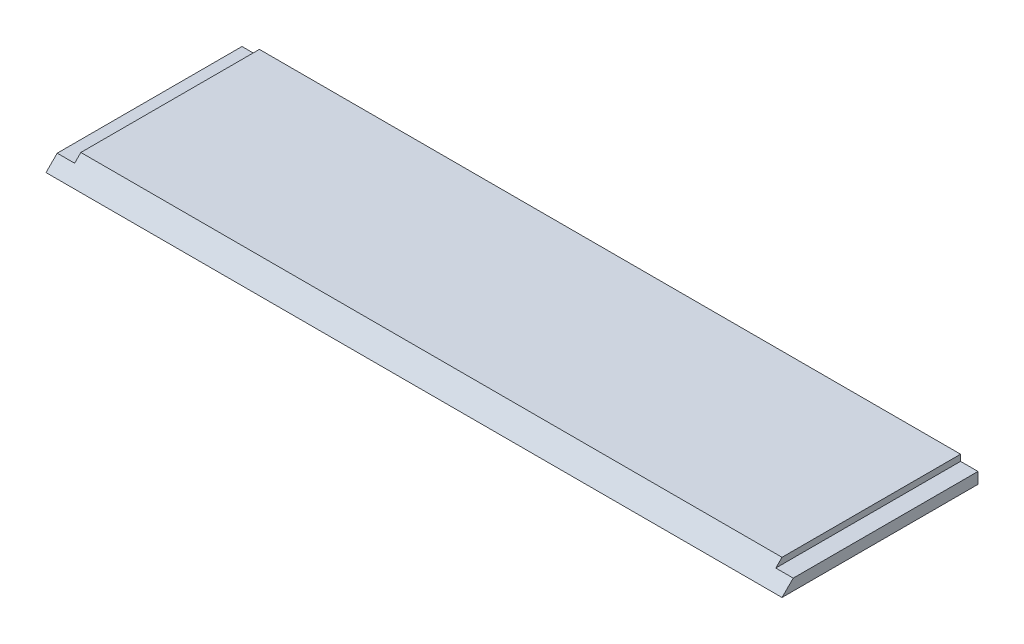
ISO-10303-21;
HEADER;
FILE_DESCRIPTION(('STEP AP214'),'2;1');
FILE_NAME('part.step','',(''),(''),'','','');
FILE_SCHEMA(('AUTOMOTIVE_DESIGN { 1 0 10303 214 1 1 1 1 }'));
ENDSEC;
DATA;
#1=APPLICATION_CONTEXT('core data for automotive mechanical design processes');
#2=APPLICATION_PROTOCOL_DEFINITION('international standard','automotive_design',2000,#1);
#3=PRODUCT_CONTEXT('',#1,'mechanical');
#4=PRODUCT('Part','Part','',(#3));
#5=PRODUCT_RELATED_PRODUCT_CATEGORY('part','',(#4));
#6=PRODUCT_DEFINITION_FORMATION('','',#4);
#7=PRODUCT_DEFINITION_CONTEXT('part definition',#1,'design');
#8=PRODUCT_DEFINITION('design','',#6,#7);
#9=PRODUCT_DEFINITION_SHAPE('','',#8);
#10=(LENGTH_UNIT() NAMED_UNIT(*) SI_UNIT(.MILLI.,.METRE.));
#11=(NAMED_UNIT(*) PLANE_ANGLE_UNIT() SI_UNIT($,.RADIAN.));
#12=(NAMED_UNIT(*) SI_UNIT($,.STERADIAN.) SOLID_ANGLE_UNIT());
#13=UNCERTAINTY_MEASURE_WITH_UNIT(LENGTH_MEASURE(1.E-05),#10,'distance_accuracy_value','');
#14=(GEOMETRIC_REPRESENTATION_CONTEXT(3) GLOBAL_UNCERTAINTY_ASSIGNED_CONTEXT((#13)) GLOBAL_UNIT_ASSIGNED_CONTEXT((#10,
#11,#12)) REPRESENTATION_CONTEXT('',''));
#15=CARTESIAN_POINT('',(0.,0.,0.));
#16=DIRECTION('',(0.,0.,1.));
#17=DIRECTION('',(1.,0.,0.));
#18=AXIS2_PLACEMENT_3D('',#15,#16,#17);
#19=CARTESIAN_POINT('',(-54.500655021834,2.8,-28.8001091703056));
#20=DIRECTION('',(1.,0.,0.));
#21=DIRECTION('',(0.,0.,-1.));
#22=AXIS2_PLACEMENT_3D('',#19,#20,#21);
#23=PLANE('',#22);
#24=DIRECTION('',(0.,0.,1.));
#25=VECTOR('',#24,1.);
#26=CARTESIAN_POINT('',(-54.500655021834,1.8,-28.8001091703056));
#27=LINE('',#26,#25);
#28=CARTESIAN_POINT('',(-54.500655021834,1.8,-28.8001091703056));
#29=VERTEX_POINT('',#28);
#30=CARTESIAN_POINT('',(-54.500655021834,1.8,0.899890829694499));
#31=VERTEX_POINT('',#30);
#32=EDGE_CURVE('E57',#29,#31,#27,.T.);
#33=ORIENTED_EDGE('',*,*,#32,.F.);
#34=DIRECTION('',(0.,-1.,0.));
#35=VECTOR('',#34,1.);
#36=CARTESIAN_POINT('',(-54.500655021834,2.8,-28.8001091703056));
#37=LINE('',#36,#35);
#38=CARTESIAN_POINT('',(-54.500655021834,0.,-28.8001091703056));
#39=VERTEX_POINT('',#38);
#40=EDGE_CURVE('E122',#29,#39,#37,.T.);
#41=ORIENTED_EDGE('',*,*,#40,.T.);
#42=DIRECTION('',(0.,0.,1.));
#43=VECTOR('',#42,1.);
#44=CARTESIAN_POINT('',(-54.500655021834,0.,-28.8001091703056));
#45=LINE('',#44,#43);
#46=CARTESIAN_POINT('',(-54.500655021834,0.,2.69989082969443));
#47=VERTEX_POINT('',#46);
#48=EDGE_CURVE('E149',#39,#47,#45,.T.);
#49=ORIENTED_EDGE('',*,*,#48,.T.);
#50=DIRECTION('',(0.,0.707106781186551,-0.707106781186544));
#51=VECTOR('',#50,1.);
#52=CARTESIAN_POINT('',(-54.500655021834,2.8,-0.10010917030549));
#53=LINE('',#52,#51);
#54=EDGE_CURVE('E138',#47,#31,#53,.T.);
#55=ORIENTED_EDGE('',*,*,#54,.T.);
#56=EDGE_LOOP('',(#33,#41,#49,#55));
#57=FACE_BOUND('',#56,.T.);
#58=ADVANCED_FACE('F35',(#57),#23,.F.);
#59=CARTESIAN_POINT('',(63.7993449781659,2.8,-28.8001091703056));
#60=DIRECTION('',(-1.,0.,0.));
#61=DIRECTION('',(0.,0.,1.));
#62=AXIS2_PLACEMENT_3D('',#59,#60,#61);
#63=PLANE('',#62);
#64=DIRECTION('',(0.,-1.,0.));
#65=VECTOR('',#64,1.);
#66=CARTESIAN_POINT('',(63.7993449781659,2.8,-28.8001091703056));
#67=LINE('',#66,#65);
#68=CARTESIAN_POINT('',(63.7993449781659,1.8,-28.8001091703056));
#69=VERTEX_POINT('',#68);
#70=CARTESIAN_POINT('',(63.7993449781659,0.,-28.8001091703056));
#71=VERTEX_POINT('',#70);
#72=EDGE_CURVE('E113',#69,#71,#67,.T.);
#73=ORIENTED_EDGE('',*,*,#72,.F.);
#74=DIRECTION('',(0.,0.,-1.));
#75=VECTOR('',#74,1.);
#76=CARTESIAN_POINT('',(63.7993449781659,1.8,-28.8001091703056));
#77=LINE('',#76,#75);
#78=CARTESIAN_POINT('',(63.7993449781659,1.8,0.899890829694449));
#79=VERTEX_POINT('',#78);
#80=EDGE_CURVE('E97',#79,#69,#77,.T.);
#81=ORIENTED_EDGE('',*,*,#80,.F.);
#82=DIRECTION('',(0.,0.707106781186551,-0.707106781186544));
#83=VECTOR('',#82,1.);
#84=CARTESIAN_POINT('',(63.799344978166,2.8,-0.100109170305542));
#85=LINE('',#84,#83);
#86=CARTESIAN_POINT('',(63.799344978166,0.,2.69989082969443));
#87=VERTEX_POINT('',#86);
#88=EDGE_CURVE('E135',#87,#79,#85,.T.);
#89=ORIENTED_EDGE('',*,*,#88,.F.);
#90=DIRECTION('',(0.,0.,-1.));
#91=VECTOR('',#90,1.);
#92=CARTESIAN_POINT('',(63.7993449781659,0.,-28.8001091703056));
#93=LINE('',#92,#91);
#94=EDGE_CURVE('E119',#87,#71,#93,.T.);
#95=ORIENTED_EDGE('',*,*,#94,.T.);
#96=EDGE_LOOP('',(#73,#81,#89,#95));
#97=FACE_BOUND('',#96,.T.);
#98=ADVANCED_FACE('F117',(#97),#63,.F.);
#99=CARTESIAN_POINT('',(-54.500655021834,2.8,-28.8001091703056));
#100=DIRECTION('',(0.,0.,1.));
#101=DIRECTION('',(1.,0.,0.));
#102=AXIS2_PLACEMENT_3D('',#99,#100,#101);
#103=PLANE('',#102);
#104=DIRECTION('',(-1.,0.,0.));
#105=VECTOR('',#104,1.);
#106=CARTESIAN_POINT('',(-54.500655021834,2.8,-28.8001091703056));
#107=LINE('',#106,#105);
#108=CARTESIAN_POINT('',(60.999344978166,2.8,-28.8001091703056));
#109=VERTEX_POINT('',#108);
#110=CARTESIAN_POINT('',(-51.700655021834,2.8,-28.8001091703056));
#111=VERTEX_POINT('',#110);
#112=EDGE_CURVE('E126',#109,#111,#107,.T.);
#113=ORIENTED_EDGE('',*,*,#112,.F.);
#114=DIRECTION('',(0.,1.,0.));
#115=VECTOR('',#114,1.);
#116=CARTESIAN_POINT('',(60.999344978166,1.8,-28.8001091703056));
#117=LINE('',#116,#115);
#118=CARTESIAN_POINT('',(60.999344978166,1.8,-28.8001091703056));
#119=VERTEX_POINT('',#118);
#120=EDGE_CURVE('E115',#119,#109,#117,.T.);
#121=ORIENTED_EDGE('',*,*,#120,.F.);
#122=DIRECTION('',(-1.,0.,0.));
#123=VECTOR('',#122,1.);
#124=CARTESIAN_POINT('',(63.7993449781659,1.8,-28.8001091703056));
#125=LINE('',#124,#123);
#126=EDGE_CURVE('E100',#69,#119,#125,.T.);
#127=ORIENTED_EDGE('',*,*,#126,.F.);
#128=ORIENTED_EDGE('',*,*,#72,.T.);
#129=DIRECTION('',(-1.,0.,0.));
#130=VECTOR('',#129,1.);
#131=CARTESIAN_POINT('',(-54.500655021834,0.,-28.8001091703056));
#132=LINE('',#131,#130);
#133=EDGE_CURVE('E151',#71,#39,#132,.T.);
#134=ORIENTED_EDGE('',*,*,#133,.T.);
#135=ORIENTED_EDGE('',*,*,#40,.F.);
#136=DIRECTION('',(-1.,0.,0.));
#137=VECTOR('',#136,1.);
#138=CARTESIAN_POINT('',(-54.500655021834,1.8,-28.8001091703056));
#139=LINE('',#138,#137);
#140=CARTESIAN_POINT('',(-51.700655021834,1.8,-28.8001091703056));
#141=VERTEX_POINT('',#140);
#142=EDGE_CURVE('E145',#141,#29,#139,.T.);
#143=ORIENTED_EDGE('',*,*,#142,.F.);
#144=DIRECTION('',(0.,1.,0.));
#145=VECTOR('',#144,1.);
#146=CARTESIAN_POINT('',(-51.700655021834,1.8,-28.8001091703056));
#147=LINE('',#146,#145);
#148=EDGE_CURVE('E139',#141,#111,#147,.T.);
#149=ORIENTED_EDGE('',*,*,#148,.T.);
#150=EDGE_LOOP('',(#113,#121,#127,#128,#134,#135,#143,#149));
#151=FACE_BOUND('',#150,.T.);
#152=ADVANCED_FACE('F111',(#151),#103,.F.);
#153=CARTESIAN_POINT('',(0.,2.8,0.));
#154=DIRECTION('',(0.,1.,0.));
#155=DIRECTION('',(0.,0.,1.));
#156=AXIS2_PLACEMENT_3D('',#153,#154,#155);
#157=PLANE('',#156);
#158=DIRECTION('',(0.,0.,1.));
#159=VECTOR('',#158,1.);
#160=CARTESIAN_POINT('',(60.999344978166,2.8,-28.8001091703056));
#161=LINE('',#160,#159);
#162=CARTESIAN_POINT('',(60.999344978166,2.8,-0.100109170305542));
#163=VERTEX_POINT('',#162);
#164=EDGE_CURVE('E107',#109,#163,#161,.T.);
#165=ORIENTED_EDGE('',*,*,#164,.F.);
#166=ORIENTED_EDGE('',*,*,#112,.T.);
#167=DIRECTION('',(0.,0.,-1.));
#168=VECTOR('',#167,1.);
#169=CARTESIAN_POINT('',(-51.700655021834,2.8,-28.8001091703056));
#170=LINE('',#169,#168);
#171=CARTESIAN_POINT('',(-51.700655021834,2.8,-0.100109170305489));
#172=VERTEX_POINT('',#171);
#173=EDGE_CURVE('E162',#172,#111,#170,.T.);
#174=ORIENTED_EDGE('',*,*,#173,.F.);
#175=DIRECTION('',(1.,0.,0.));
#176=VECTOR('',#175,1.);
#177=CARTESIAN_POINT('',(-54.500655021834,2.8,-0.10010917030549));
#178=LINE('',#177,#176);
#179=EDGE_CURVE('E142',#172,#163,#178,.T.);
#180=ORIENTED_EDGE('',*,*,#179,.T.);
#181=EDGE_LOOP('',(#165,#166,#174,#180));
#182=FACE_BOUND('',#181,.T.);
#183=ADVANCED_FACE('F178',(#182),#157,.T.);
#184=CARTESIAN_POINT('',(0.,0.,0.));
#185=DIRECTION('',(0.,1.,0.));
#186=DIRECTION('',(0.,0.,1.));
#187=AXIS2_PLACEMENT_3D('',#184,#185,#186);
#188=PLANE('',#187);
#189=ORIENTED_EDGE('',*,*,#48,.F.);
#190=ORIENTED_EDGE('',*,*,#133,.F.);
#191=ORIENTED_EDGE('',*,*,#94,.F.);
#192=DIRECTION('',(1.,0.,0.));
#193=VECTOR('',#192,1.);
#194=CARTESIAN_POINT('',(-54.500655021834,0.,2.69989082969443));
#195=LINE('',#194,#193);
#196=EDGE_CURVE('E137',#47,#87,#195,.T.);
#197=ORIENTED_EDGE('',*,*,#196,.F.);
#198=EDGE_LOOP('',(#189,#190,#191,#197));
#199=FACE_BOUND('',#198,.T.);
#200=ADVANCED_FACE('F159',(#199),#188,.F.);
#201=CARTESIAN_POINT('',(-54.500655021834,2.8,-0.10010917030549));
#202=DIRECTION('',(0.,-0.707106781186544,-0.707106781186551));
#203=DIRECTION('',(0.,0.707106781186551,-0.707106781186544));
#204=AXIS2_PLACEMENT_3D('',#201,#202,#203);
#205=PLANE('',#204);
#206=DIRECTION('',(-1.,0.,0.));
#207=VECTOR('',#206,1.);
#208=CARTESIAN_POINT('',(-54.500655021834,1.8,0.8998908296945));
#209=LINE('',#208,#207);
#210=CARTESIAN_POINT('',(60.999344978166,1.8,0.899890829694449));
#211=VERTEX_POINT('',#210);
#212=EDGE_CURVE('E42',#79,#211,#209,.T.);
#213=ORIENTED_EDGE('',*,*,#212,.T.);
#214=DIRECTION('',(0.,0.707106781186551,-0.707106781186544));
#215=VECTOR('',#214,1.);
#216=CARTESIAN_POINT('',(60.999344978166,2.79999999999996,-0.100109170305502));
#217=LINE('',#216,#215);
#218=EDGE_CURVE('E11',#211,#163,#217,.T.);
#219=ORIENTED_EDGE('',*,*,#218,.T.);
#220=ORIENTED_EDGE('',*,*,#179,.F.);
#221=DIRECTION('',(0.,-0.707106781186551,0.707106781186544));
#222=VECTOR('',#221,1.);
#223=CARTESIAN_POINT('',(-51.700655021834,2.8,-0.100109170305491));
#224=LINE('',#223,#222);
#225=CARTESIAN_POINT('',(-51.700655021834,1.8,0.899890829694498));
#226=VERTEX_POINT('',#225);
#227=EDGE_CURVE('E124',#172,#226,#224,.T.);
#228=ORIENTED_EDGE('',*,*,#227,.T.);
#229=DIRECTION('',(1.,0.,0.));
#230=VECTOR('',#229,1.);
#231=CARTESIAN_POINT('',(-54.500655021834,1.8,0.8998908296945));
#232=LINE('',#231,#230);
#233=EDGE_CURVE('E121',#31,#226,#232,.T.);
#234=ORIENTED_EDGE('',*,*,#233,.F.);
#235=ORIENTED_EDGE('',*,*,#54,.F.);
#236=ORIENTED_EDGE('',*,*,#196,.T.);
#237=ORIENTED_EDGE('',*,*,#88,.T.);
#238=EDGE_LOOP('',(#213,#219,#220,#228,#234,#235,#236,#237));
#239=FACE_BOUND('',#238,.T.);
#240=ADVANCED_FACE('F132',(#239),#205,.F.);
#241=CARTESIAN_POINT('',(-51.700655021834,1.8,-28.8001091703056));
#242=DIRECTION('',(1.,0.,0.));
#243=DIRECTION('',(0.,0.,-1.));
#244=AXIS2_PLACEMENT_3D('',#241,#242,#243);
#245=PLANE('',#244);
#246=ORIENTED_EDGE('',*,*,#173,.T.);
#247=ORIENTED_EDGE('',*,*,#148,.F.);
#248=DIRECTION('',(0.,0.,-1.));
#249=VECTOR('',#248,1.);
#250=CARTESIAN_POINT('',(-51.700655021834,1.8,-28.8001091703056));
#251=LINE('',#250,#249);
#252=EDGE_CURVE('E161',#226,#141,#251,.T.);
#253=ORIENTED_EDGE('',*,*,#252,.F.);
#254=ORIENTED_EDGE('',*,*,#227,.F.);
#255=EDGE_LOOP('',(#246,#247,#253,#254));
#256=FACE_BOUND('',#255,.T.);
#257=ADVANCED_FACE('F174',(#256),#245,.F.);
#258=CARTESIAN_POINT('',(0.,1.8,0.));
#259=DIRECTION('',(0.,1.,0.));
#260=DIRECTION('',(0.,0.,1.));
#261=AXIS2_PLACEMENT_3D('',#258,#259,#260);
#262=PLANE('',#261);
#263=ORIENTED_EDGE('',*,*,#233,.T.);
#264=ORIENTED_EDGE('',*,*,#252,.T.);
#265=ORIENTED_EDGE('',*,*,#142,.T.);
#266=ORIENTED_EDGE('',*,*,#32,.T.);
#267=EDGE_LOOP('',(#263,#264,#265,#266));
#268=FACE_BOUND('',#267,.T.);
#269=ADVANCED_FACE('F170',(#268),#262,.T.);
#270=CARTESIAN_POINT('',(60.999344978166,1.8,-28.8001091703056));
#271=DIRECTION('',(-1.,0.,0.));
#272=DIRECTION('',(0.,0.,1.));
#273=AXIS2_PLACEMENT_3D('',#270,#271,#272);
#274=PLANE('',#273);
#275=DIRECTION('',(0.,0.,1.));
#276=VECTOR('',#275,1.);
#277=CARTESIAN_POINT('',(60.999344978166,1.8,-28.8001091703056));
#278=LINE('',#277,#276);
#279=EDGE_CURVE('E49',#119,#211,#278,.T.);
#280=ORIENTED_EDGE('',*,*,#279,.F.);
#281=ORIENTED_EDGE('',*,*,#120,.T.);
#282=ORIENTED_EDGE('',*,*,#164,.T.);
#283=ORIENTED_EDGE('',*,*,#218,.F.);
#284=EDGE_LOOP('',(#280,#281,#282,#283));
#285=FACE_BOUND('',#284,.T.);
#286=ADVANCED_FACE('F181',(#285),#274,.F.);
#287=CARTESIAN_POINT('',(0.,1.8,0.));
#288=DIRECTION('',(0.,-1.,0.));
#289=DIRECTION('',(0.,0.,-1.));
#290=AXIS2_PLACEMENT_3D('',#287,#288,#289);
#291=PLANE('',#290);
#292=ORIENTED_EDGE('',*,*,#80,.T.);
#293=ORIENTED_EDGE('',*,*,#126,.T.);
#294=ORIENTED_EDGE('',*,*,#279,.T.);
#295=ORIENTED_EDGE('',*,*,#212,.F.);
#296=EDGE_LOOP('',(#292,#293,#294,#295));
#297=FACE_BOUND('',#296,.T.);
#298=ADVANCED_FACE('F99',(#297),#291,.F.);
#299=CLOSED_SHELL('',(#58,#98,#152,#183,#200,#240,#257,#269,#286,#298));
#300=MANIFOLD_SOLID_BREP('B2',#299);
#301=ADVANCED_BREP_SHAPE_REPRESENTATION('',(#18,#300),#14);
#302=SHAPE_DEFINITION_REPRESENTATION(#9,#301);
ENDSEC;
END-ISO-10303-21;
